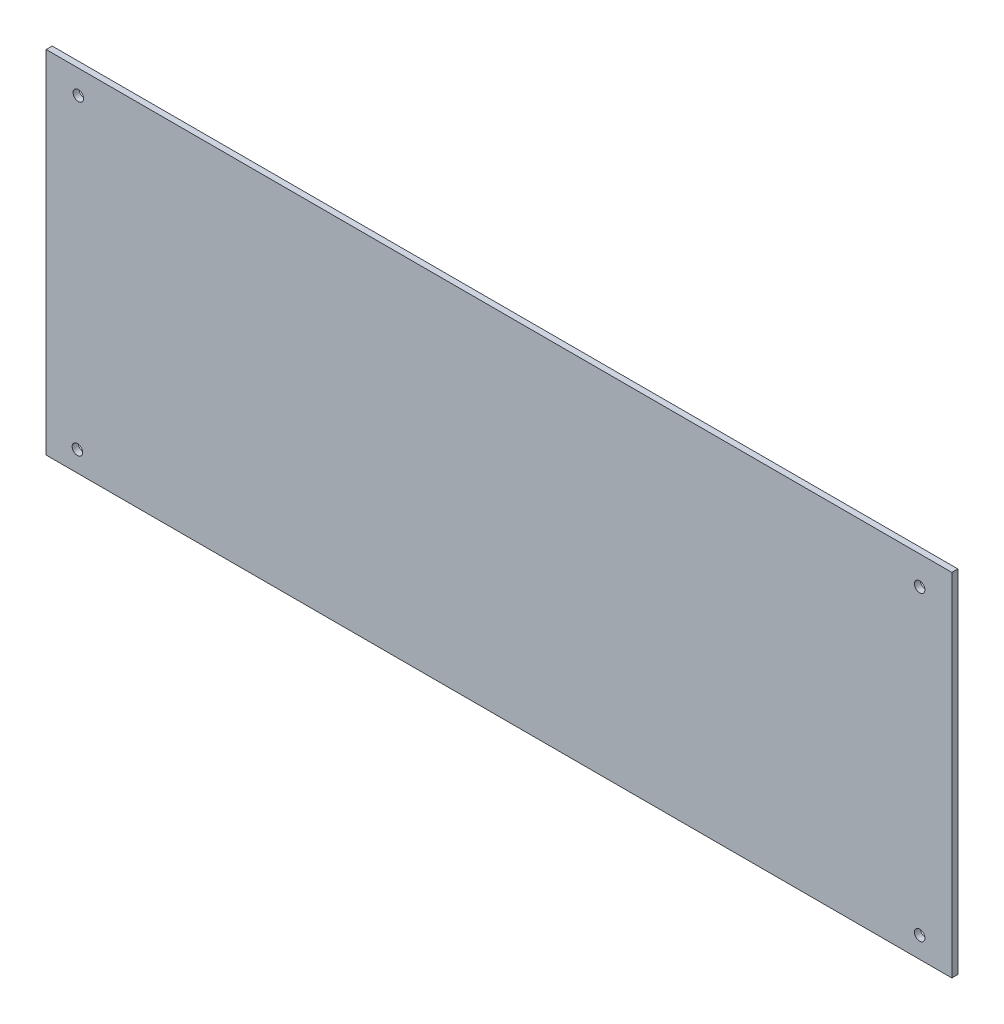
ISO-10303-21;
HEADER;
FILE_DESCRIPTION(('STEP AP214'),'2;1');
FILE_NAME('part.step','',(''),(''),'','','');
FILE_SCHEMA(('AUTOMOTIVE_DESIGN { 1 0 10303 214 1 1 1 1 }'));
ENDSEC;
DATA;
#1=APPLICATION_CONTEXT('core data for automotive mechanical design processes');
#2=APPLICATION_PROTOCOL_DEFINITION('international standard','automotive_design',2000,#1);
#3=PRODUCT_CONTEXT('',#1,'mechanical');
#4=PRODUCT('Part','Part','',(#3));
#5=PRODUCT_RELATED_PRODUCT_CATEGORY('part','',(#4));
#6=PRODUCT_DEFINITION_FORMATION('','',#4);
#7=PRODUCT_DEFINITION_CONTEXT('part definition',#1,'design');
#8=PRODUCT_DEFINITION('design','',#6,#7);
#9=PRODUCT_DEFINITION_SHAPE('','',#8);
#10=(LENGTH_UNIT() NAMED_UNIT(*) SI_UNIT(.MILLI.,.METRE.));
#11=(NAMED_UNIT(*) PLANE_ANGLE_UNIT() SI_UNIT($,.RADIAN.));
#12=(NAMED_UNIT(*) SI_UNIT($,.STERADIAN.) SOLID_ANGLE_UNIT());
#13=UNCERTAINTY_MEASURE_WITH_UNIT(LENGTH_MEASURE(1.E-05),#10,'distance_accuracy_value','');
#14=(GEOMETRIC_REPRESENTATION_CONTEXT(3) GLOBAL_UNCERTAINTY_ASSIGNED_CONTEXT((#13)) GLOBAL_UNIT_ASSIGNED_CONTEXT((#10,
#11,#12)) REPRESENTATION_CONTEXT('',''));
#15=CARTESIAN_POINT('',(0.,0.,0.));
#16=DIRECTION('',(0.,0.,1.));
#17=DIRECTION('',(1.,0.,0.));
#18=AXIS2_PLACEMENT_3D('',#15,#16,#17);
#19=CARTESIAN_POINT('',(0.,0.,3.));
#20=DIRECTION('',(-1.,0.,0.));
#21=DIRECTION('',(0.,0.,1.));
#22=AXIS2_PLACEMENT_3D('',#19,#20,#21);
#23=PLANE('',#22);
#24=DIRECTION('',(0.,1.,0.));
#25=VECTOR('',#24,1.);
#26=CARTESIAN_POINT('',(0.,0.,0.));
#27=LINE('',#26,#25);
#28=CARTESIAN_POINT('',(0.,0.,0.));
#29=VERTEX_POINT('',#28);
#30=CARTESIAN_POINT('',(0.,174.64,0.));
#31=VERTEX_POINT('',#30);
#32=EDGE_CURVE('E113',#29,#31,#27,.T.);
#33=ORIENTED_EDGE('',*,*,#32,.T.);
#34=DIRECTION('',(0.,0.,-1.));
#35=VECTOR('',#34,1.);
#36=CARTESIAN_POINT('',(0.,174.64,3.));
#37=LINE('',#36,#35);
#38=CARTESIAN_POINT('',(0.,174.64,3.));
#39=VERTEX_POINT('',#38);
#40=EDGE_CURVE('E13',#39,#31,#37,.T.);
#41=ORIENTED_EDGE('',*,*,#40,.F.);
#42=DIRECTION('',(0.,1.,0.));
#43=VECTOR('',#42,1.);
#44=CARTESIAN_POINT('',(0.,0.,3.));
#45=LINE('',#44,#43);
#46=CARTESIAN_POINT('',(0.,0.,3.));
#47=VERTEX_POINT('',#46);
#48=EDGE_CURVE('E100',#47,#39,#45,.T.);
#49=ORIENTED_EDGE('',*,*,#48,.F.);
#50=DIRECTION('',(0.,0.,-1.));
#51=VECTOR('',#50,1.);
#52=CARTESIAN_POINT('',(0.,0.,3.));
#53=LINE('',#52,#51);
#54=EDGE_CURVE('E109',#47,#29,#53,.T.);
#55=ORIENTED_EDGE('',*,*,#54,.T.);
#56=EDGE_LOOP('',(#33,#41,#49,#55));
#57=FACE_BOUND('',#56,.T.);
#58=ADVANCED_FACE('F47',(#57),#23,.F.);
#59=CARTESIAN_POINT('',(0.,174.64,3.));
#60=DIRECTION('',(0.,-1.,0.));
#61=DIRECTION('',(1.,0.,0.));
#62=AXIS2_PLACEMENT_3D('',#59,#60,#61);
#63=PLANE('',#62);
#64=DIRECTION('',(-1.,0.,0.));
#65=VECTOR('',#64,1.);
#66=CARTESIAN_POINT('',(0.,174.64,0.));
#67=LINE('',#66,#65);
#68=CARTESIAN_POINT('',(-450.3,174.64,0.));
#69=VERTEX_POINT('',#68);
#70=EDGE_CURVE('E104',#31,#69,#67,.T.);
#71=ORIENTED_EDGE('',*,*,#70,.T.);
#72=DIRECTION('',(0.,0.,-1.));
#73=VECTOR('',#72,1.);
#74=CARTESIAN_POINT('',(-450.3,174.64,3.));
#75=LINE('',#74,#73);
#76=CARTESIAN_POINT('',(-450.3,174.64,3.));
#77=VERTEX_POINT('',#76);
#78=EDGE_CURVE('E56',#77,#69,#75,.T.);
#79=ORIENTED_EDGE('',*,*,#78,.F.);
#80=DIRECTION('',(-1.,0.,0.));
#81=VECTOR('',#80,1.);
#82=CARTESIAN_POINT('',(0.,174.64,3.));
#83=LINE('',#82,#81);
#84=EDGE_CURVE('E95',#39,#77,#83,.T.);
#85=ORIENTED_EDGE('',*,*,#84,.F.);
#86=ORIENTED_EDGE('',*,*,#40,.T.);
#87=EDGE_LOOP('',(#71,#79,#85,#86));
#88=FACE_BOUND('',#87,.T.);
#89=ADVANCED_FACE('F103',(#88),#63,.F.);
#90=CARTESIAN_POINT('',(-450.3,0.,3.));
#91=DIRECTION('',(1.,0.,0.));
#92=DIRECTION('',(0.,0.,-1.));
#93=AXIS2_PLACEMENT_3D('',#90,#91,#92);
#94=PLANE('',#93);
#95=DIRECTION('',(0.,-1.,0.));
#96=VECTOR('',#95,1.);
#97=CARTESIAN_POINT('',(-450.3,0.,0.));
#98=LINE('',#97,#96);
#99=CARTESIAN_POINT('',(-450.3,0.,0.));
#100=VERTEX_POINT('',#99);
#101=EDGE_CURVE('E82',#69,#100,#98,.T.);
#102=ORIENTED_EDGE('',*,*,#101,.T.);
#103=DIRECTION('',(0.,0.,-1.));
#104=VECTOR('',#103,1.);
#105=CARTESIAN_POINT('',(-450.3,0.,3.));
#106=LINE('',#105,#104);
#107=CARTESIAN_POINT('',(-450.3,0.,3.));
#108=VERTEX_POINT('',#107);
#109=EDGE_CURVE('E105',#108,#100,#106,.T.);
#110=ORIENTED_EDGE('',*,*,#109,.F.);
#111=DIRECTION('',(0.,-1.,0.));
#112=VECTOR('',#111,1.);
#113=CARTESIAN_POINT('',(-450.3,0.,3.));
#114=LINE('',#113,#112);
#115=EDGE_CURVE('E98',#77,#108,#114,.T.);
#116=ORIENTED_EDGE('',*,*,#115,.F.);
#117=ORIENTED_EDGE('',*,*,#78,.T.);
#118=EDGE_LOOP('',(#102,#110,#116,#117));
#119=FACE_BOUND('',#118,.T.);
#120=ADVANCED_FACE('F107',(#119),#94,.F.);
#121=CARTESIAN_POINT('',(0.,0.,3.));
#122=DIRECTION('',(0.,1.,0.));
#123=DIRECTION('',(-1.,0.,0.));
#124=AXIS2_PLACEMENT_3D('',#121,#122,#123);
#125=PLANE('',#124);
#126=DIRECTION('',(1.,0.,0.));
#127=VECTOR('',#126,1.);
#128=CARTESIAN_POINT('',(0.,0.,0.));
#129=LINE('',#128,#127);
#130=EDGE_CURVE('E88',#100,#29,#129,.T.);
#131=ORIENTED_EDGE('',*,*,#130,.T.);
#132=ORIENTED_EDGE('',*,*,#54,.F.);
#133=DIRECTION('',(1.,0.,0.));
#134=VECTOR('',#133,1.);
#135=CARTESIAN_POINT('',(0.,0.,3.));
#136=LINE('',#135,#134);
#137=EDGE_CURVE('E65',#108,#47,#136,.T.);
#138=ORIENTED_EDGE('',*,*,#137,.F.);
#139=ORIENTED_EDGE('',*,*,#109,.T.);
#140=EDGE_LOOP('',(#131,#132,#138,#139));
#141=FACE_BOUND('',#140,.T.);
#142=ADVANCED_FACE('F164',(#141),#125,.F.);
#143=CARTESIAN_POINT('',(0.,0.,3.));
#144=DIRECTION('',(0.,0.,1.));
#145=DIRECTION('',(1.,0.,0.));
#146=AXIS2_PLACEMENT_3D('',#143,#144,#145);
#147=PLANE('',#146);
#148=CARTESIAN_POINT('',(-434.3,162.816794702003,3.));
#149=DIRECTION('',(0.,0.,1.));
#150=DIRECTION('',(1.,0.,0.));
#151=AXIS2_PLACEMENT_3D('',#148,#149,#150);
#152=CIRCLE('',#151,2.60000000000001);
#153=CARTESIAN_POINT('',(-431.7,162.816794702003,3.));
#154=VERTEX_POINT('',#153);
#155=EDGE_CURVE('E231',#154,#154,#152,.T.);
#156=ORIENTED_EDGE('',*,*,#155,.F.);
#157=EDGE_LOOP('',(#156));
#158=FACE_BOUND('',#157,.T.);
#159=CARTESIAN_POINT('',(-434.750971798126,10.1777680174234,3.));
#160=DIRECTION('',(0.,0.,1.));
#161=DIRECTION('',(1.,0.,0.));
#162=AXIS2_PLACEMENT_3D('',#159,#160,#161);
#163=CIRCLE('',#162,2.60000000000002);
#164=CARTESIAN_POINT('',(-432.150971798126,10.1777680174234,3.));
#165=VERTEX_POINT('',#164);
#166=EDGE_CURVE('E226',#165,#165,#163,.T.);
#167=ORIENTED_EDGE('',*,*,#166,.F.);
#168=EDGE_LOOP('',(#167));
#169=FACE_BOUND('',#168,.T.);
#170=CARTESIAN_POINT('',(-16.,10.462671451708,3.));
#171=DIRECTION('',(0.,0.,1.));
#172=DIRECTION('',(1.,0.,0.));
#173=AXIS2_PLACEMENT_3D('',#170,#171,#172);
#174=CIRCLE('',#173,2.60000000000005);
#175=CARTESIAN_POINT('',(-13.3999999999999,10.462671451708,3.));
#176=VERTEX_POINT('',#175);
#177=EDGE_CURVE('E219',#176,#176,#174,.T.);
#178=ORIENTED_EDGE('',*,*,#177,.F.);
#179=EDGE_LOOP('',(#178));
#180=FACE_BOUND('',#179,.T.);
#181=CARTESIAN_POINT('',(-16.,160.425773654651,3.));
#182=DIRECTION('',(0.,0.,1.));
#183=DIRECTION('',(1.,0.,0.));
#184=AXIS2_PLACEMENT_3D('',#181,#182,#183);
#185=CIRCLE('',#184,2.59999999999999);
#186=CARTESIAN_POINT('',(-13.4,160.425773654651,3.));
#187=VERTEX_POINT('',#186);
#188=EDGE_CURVE('E125',#187,#187,#185,.T.);
#189=ORIENTED_EDGE('',*,*,#188,.F.);
#190=EDGE_LOOP('',(#189));
#191=FACE_BOUND('',#190,.T.);
#192=ORIENTED_EDGE('',*,*,#48,.T.);
#193=ORIENTED_EDGE('',*,*,#84,.T.);
#194=ORIENTED_EDGE('',*,*,#115,.T.);
#195=ORIENTED_EDGE('',*,*,#137,.T.);
#196=EDGE_LOOP('',(#192,#193,#194,#195));
#197=FACE_BOUND('',#196,.T.);
#198=ADVANCED_FACE('F96',(#158,#169,#180,#191,#197),#147,.T.);
#199=CARTESIAN_POINT('',(0.,0.,0.));
#200=DIRECTION('',(0.,0.,1.));
#201=DIRECTION('',(1.,0.,0.));
#202=AXIS2_PLACEMENT_3D('',#199,#200,#201);
#203=PLANE('',#202);
#204=CARTESIAN_POINT('',(-434.3,162.816794702003,0.));
#205=DIRECTION('',(0.,0.,1.));
#206=DIRECTION('',(1.,0.,0.));
#207=AXIS2_PLACEMENT_3D('',#204,#205,#206);
#208=CIRCLE('',#207,2.60000000000001);
#209=CARTESIAN_POINT('',(-431.7,162.816794702003,0.));
#210=VERTEX_POINT('',#209);
#211=EDGE_CURVE('E50',#210,#210,#208,.T.);
#212=ORIENTED_EDGE('',*,*,#211,.T.);
#213=EDGE_LOOP('',(#212));
#214=FACE_BOUND('',#213,.T.);
#215=CARTESIAN_POINT('',(-434.750971798126,10.1777680174234,0.));
#216=DIRECTION('',(0.,0.,1.));
#217=DIRECTION('',(1.,0.,0.));
#218=AXIS2_PLACEMENT_3D('',#215,#216,#217);
#219=CIRCLE('',#218,2.60000000000002);
#220=CARTESIAN_POINT('',(-432.150971798126,10.1777680174234,0.));
#221=VERTEX_POINT('',#220);
#222=EDGE_CURVE('E127',#221,#221,#219,.T.);
#223=ORIENTED_EDGE('',*,*,#222,.T.);
#224=EDGE_LOOP('',(#223));
#225=FACE_BOUND('',#224,.T.);
#226=CARTESIAN_POINT('',(-16.,10.462671451708,0.));
#227=DIRECTION('',(0.,0.,1.));
#228=DIRECTION('',(1.,0.,0.));
#229=AXIS2_PLACEMENT_3D('',#226,#227,#228);
#230=CIRCLE('',#229,2.60000000000005);
#231=CARTESIAN_POINT('',(-13.3999999999999,10.462671451708,0.));
#232=VERTEX_POINT('',#231);
#233=EDGE_CURVE('E124',#232,#232,#230,.T.);
#234=ORIENTED_EDGE('',*,*,#233,.T.);
#235=EDGE_LOOP('',(#234));
#236=FACE_BOUND('',#235,.T.);
#237=CARTESIAN_POINT('',(-16.,160.425773654651,0.));
#238=DIRECTION('',(0.,0.,1.));
#239=DIRECTION('',(1.,0.,0.));
#240=AXIS2_PLACEMENT_3D('',#237,#238,#239);
#241=CIRCLE('',#240,2.59999999999999);
#242=CARTESIAN_POINT('',(-13.4,160.425773654651,0.));
#243=VERTEX_POINT('',#242);
#244=EDGE_CURVE('E121',#243,#243,#241,.T.);
#245=ORIENTED_EDGE('',*,*,#244,.T.);
#246=EDGE_LOOP('',(#245));
#247=FACE_BOUND('',#246,.T.);
#248=ORIENTED_EDGE('',*,*,#32,.F.);
#249=ORIENTED_EDGE('',*,*,#130,.F.);
#250=ORIENTED_EDGE('',*,*,#101,.F.);
#251=ORIENTED_EDGE('',*,*,#70,.F.);
#252=EDGE_LOOP('',(#248,#249,#250,#251));
#253=FACE_BOUND('',#252,.T.);
#254=ADVANCED_FACE('F134',(#214,#225,#236,#247,#253),#203,.F.);
#255=CARTESIAN_POINT('',(-16.,160.425773654651,-17.));
#256=DIRECTION('',(0.,0.,1.));
#257=DIRECTION('',(1.,0.,0.));
#258=AXIS2_PLACEMENT_3D('',#255,#256,#257);
#259=CYLINDRICAL_SURFACE('',#258,2.59999999999999);
#260=ORIENTED_EDGE('',*,*,#188,.T.);
#261=EDGE_LOOP('',(#260));
#262=FACE_BOUND('',#261,.T.);
#263=ORIENTED_EDGE('',*,*,#244,.F.);
#264=EDGE_LOOP('',(#263));
#265=FACE_BOUND('',#264,.T.);
#266=ADVANCED_FACE('F157',(#262,#265),#259,.F.);
#267=CARTESIAN_POINT('',(-16.,10.462671451708,-17.));
#268=DIRECTION('',(0.,0.,1.));
#269=DIRECTION('',(1.,0.,0.));
#270=AXIS2_PLACEMENT_3D('',#267,#268,#269);
#271=CYLINDRICAL_SURFACE('',#270,2.60000000000005);
#272=ORIENTED_EDGE('',*,*,#177,.T.);
#273=EDGE_LOOP('',(#272));
#274=FACE_BOUND('',#273,.T.);
#275=ORIENTED_EDGE('',*,*,#233,.F.);
#276=EDGE_LOOP('',(#275));
#277=FACE_BOUND('',#276,.T.);
#278=ADVANCED_FACE('F144',(#274,#277),#271,.F.);
#279=CARTESIAN_POINT('',(-434.750971798126,10.1777680174234,-17.));
#280=DIRECTION('',(0.,0.,1.));
#281=DIRECTION('',(1.,0.,0.));
#282=AXIS2_PLACEMENT_3D('',#279,#280,#281);
#283=CYLINDRICAL_SURFACE('',#282,2.60000000000002);
#284=ORIENTED_EDGE('',*,*,#166,.T.);
#285=EDGE_LOOP('',(#284));
#286=FACE_BOUND('',#285,.T.);
#287=ORIENTED_EDGE('',*,*,#222,.F.);
#288=EDGE_LOOP('',(#287));
#289=FACE_BOUND('',#288,.T.);
#290=ADVANCED_FACE('F138',(#286,#289),#283,.F.);
#291=CARTESIAN_POINT('',(-434.3,162.816794702003,-17.));
#292=DIRECTION('',(0.,0.,1.));
#293=DIRECTION('',(1.,0.,0.));
#294=AXIS2_PLACEMENT_3D('',#291,#292,#293);
#295=CYLINDRICAL_SURFACE('',#294,2.60000000000001);
#296=ORIENTED_EDGE('',*,*,#155,.T.);
#297=EDGE_LOOP('',(#296));
#298=FACE_BOUND('',#297,.T.);
#299=ORIENTED_EDGE('',*,*,#211,.F.);
#300=EDGE_LOOP('',(#299));
#301=FACE_BOUND('',#300,.T.);
#302=ADVANCED_FACE('F136',(#298,#301),#295,.F.);
#303=CLOSED_SHELL('',(#58,#89,#120,#142,#198,#254,#266,#278,#290,#302));
#304=MANIFOLD_SOLID_BREP('B2',#303);
#305=ADVANCED_BREP_SHAPE_REPRESENTATION('',(#18,#304),#14);
#306=SHAPE_DEFINITION_REPRESENTATION(#9,#305);
ENDSEC;
END-ISO-10303-21;
